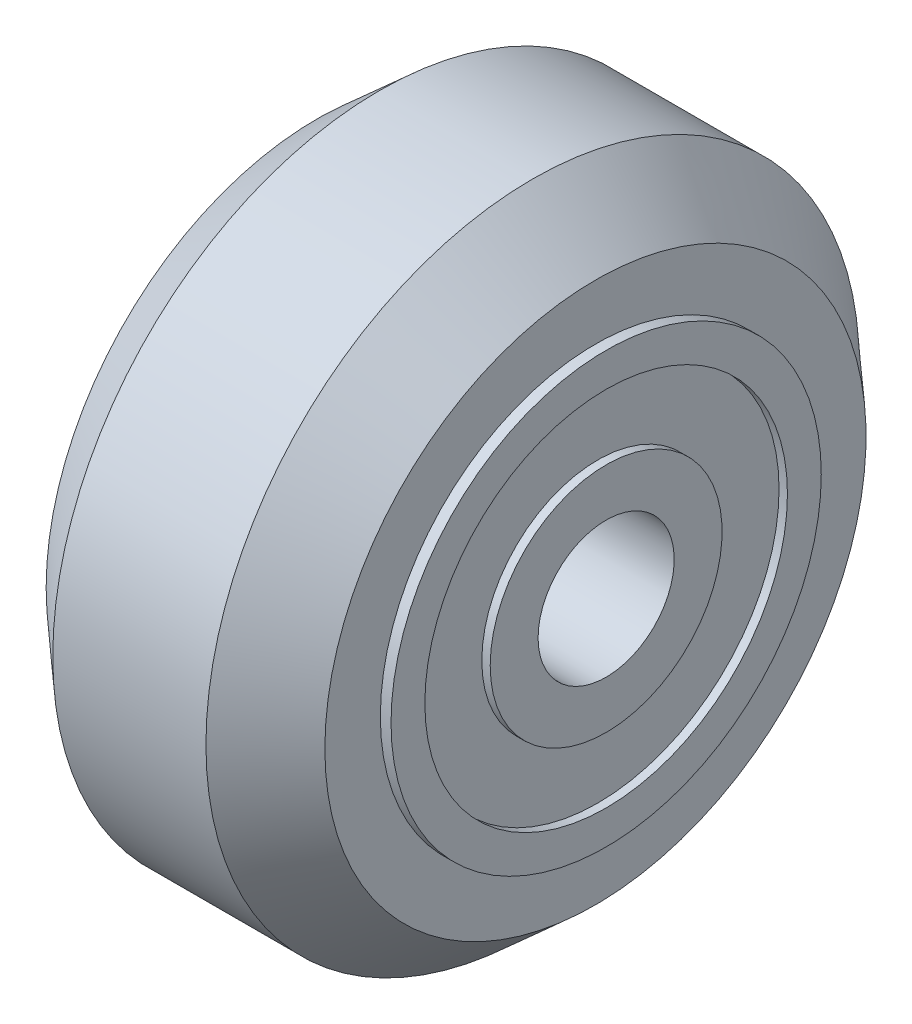
ISO-10303-21;
HEADER;
FILE_DESCRIPTION(('STEP AP214'),'2;1');
FILE_NAME('part.step','',(''),(''),'','','');
FILE_SCHEMA(('AUTOMOTIVE_DESIGN { 1 0 10303 214 1 1 1 1 }'));
ENDSEC;
DATA;
#1=APPLICATION_CONTEXT('core data for automotive mechanical design processes');
#2=APPLICATION_PROTOCOL_DEFINITION('international standard','automotive_design',2000,#1);
#3=PRODUCT_CONTEXT('',#1,'mechanical');
#4=PRODUCT('Part','Part','',(#3));
#5=PRODUCT_RELATED_PRODUCT_CATEGORY('part','',(#4));
#6=PRODUCT_DEFINITION_FORMATION('','',#4);
#7=PRODUCT_DEFINITION_CONTEXT('part definition',#1,'design');
#8=PRODUCT_DEFINITION('design','',#6,#7);
#9=PRODUCT_DEFINITION_SHAPE('','',#8);
#10=(LENGTH_UNIT() NAMED_UNIT(*) SI_UNIT(.MILLI.,.METRE.));
#11=(NAMED_UNIT(*) PLANE_ANGLE_UNIT() SI_UNIT($,.RADIAN.));
#12=(NAMED_UNIT(*) SI_UNIT($,.STERADIAN.) SOLID_ANGLE_UNIT());
#13=UNCERTAINTY_MEASURE_WITH_UNIT(LENGTH_MEASURE(1.E-05),#10,'distance_accuracy_value','');
#14=(GEOMETRIC_REPRESENTATION_CONTEXT(3) GLOBAL_UNCERTAINTY_ASSIGNED_CONTEXT((#13)) GLOBAL_UNIT_ASSIGNED_CONTEXT((#10,
#11,#12)) REPRESENTATION_CONTEXT('',''));
#15=CARTESIAN_POINT('',(0.,0.,0.));
#16=DIRECTION('',(0.,0.,1.));
#17=DIRECTION('',(1.,0.,0.));
#18=AXIS2_PLACEMENT_3D('',#15,#16,#17);
#19=CARTESIAN_POINT('',(0.,0.,0.));
#20=DIRECTION('',(-1.,0.,0.));
#21=DIRECTION('',(0.,0.,1.));
#22=AXIS2_PLACEMENT_3D('',#19,#20,#21);
#23=CYLINDRICAL_SURFACE('',#22,2.515);
#24=CARTESIAN_POINT('',(-5.545,0.,0.));
#25=DIRECTION('',(-1.,0.,0.));
#26=DIRECTION('',(0.,0.,1.));
#27=AXIS2_PLACEMENT_3D('',#24,#25,#26);
#28=CIRCLE('',#27,2.515);
#29=CARTESIAN_POINT('',(-5.545,0.,2.515));
#30=VERTEX_POINT('',#29);
#31=EDGE_CURVE('E10',#30,#30,#28,.T.);
#32=ORIENTED_EDGE('',*,*,#31,.T.);
#33=EDGE_LOOP('',(#32));
#34=FACE_BOUND('',#33,.T.);
#35=CARTESIAN_POINT('',(5.545,0.,0.));
#36=DIRECTION('',(-1.,0.,0.));
#37=DIRECTION('',(0.,0.,1.));
#38=AXIS2_PLACEMENT_3D('',#35,#36,#37);
#39=CIRCLE('',#38,2.515);
#40=CARTESIAN_POINT('',(5.545,0.,2.515));
#41=VERTEX_POINT('',#40);
#42=EDGE_CURVE('E122',#41,#41,#39,.T.);
#43=ORIENTED_EDGE('',*,*,#42,.F.);
#44=EDGE_LOOP('',(#43));
#45=FACE_BOUND('',#44,.T.);
#46=ADVANCED_FACE('F15',(#34,#45),#23,.F.);
#47=CARTESIAN_POINT('',(-5.545,0.,2.515));
#48=DIRECTION('',(-1.,0.,0.));
#49=DIRECTION('',(0.,0.,1.));
#50=AXIS2_PLACEMENT_3D('',#47,#48,#49);
#51=PLANE('',#50);
#52=CARTESIAN_POINT('',(-5.545,0.,0.));
#53=DIRECTION('',(-1.,0.,0.));
#54=DIRECTION('',(0.,0.,1.));
#55=AXIS2_PLACEMENT_3D('',#52,#53,#54);
#56=CIRCLE('',#55,4.285);
#57=CARTESIAN_POINT('',(-5.545,0.,4.285));
#58=VERTEX_POINT('',#57);
#59=EDGE_CURVE('E26',#58,#58,#56,.T.);
#60=ORIENTED_EDGE('',*,*,#59,.T.);
#61=EDGE_LOOP('',(#60));
#62=FACE_BOUND('',#61,.T.);
#63=ORIENTED_EDGE('',*,*,#31,.F.);
#64=EDGE_LOOP('',(#63));
#65=FACE_BOUND('',#64,.T.);
#66=ADVANCED_FACE('F17',(#62,#65),#51,.T.);
#67=CARTESIAN_POINT('',(0.,0.,0.));
#68=DIRECTION('',(-1.,0.,0.));
#69=DIRECTION('',(0.,0.,1.));
#70=AXIS2_PLACEMENT_3D('',#67,#68,#69);
#71=CYLINDRICAL_SURFACE('',#70,4.285);
#72=CARTESIAN_POINT('',(-5.235,0.,0.));
#73=DIRECTION('',(-1.,0.,0.));
#74=DIRECTION('',(0.,0.,1.));
#75=AXIS2_PLACEMENT_3D('',#72,#73,#74);
#76=CIRCLE('',#75,4.285);
#77=CARTESIAN_POINT('',(-5.235,0.,4.285));
#78=VERTEX_POINT('',#77);
#79=EDGE_CURVE('E98',#78,#78,#76,.T.);
#80=ORIENTED_EDGE('',*,*,#79,.T.);
#81=EDGE_LOOP('',(#80));
#82=FACE_BOUND('',#81,.T.);
#83=ORIENTED_EDGE('',*,*,#59,.F.);
#84=EDGE_LOOP('',(#83));
#85=FACE_BOUND('',#84,.T.);
#86=ADVANCED_FACE('F179',(#82,#85),#71,.T.);
#87=CARTESIAN_POINT('',(-5.235,0.,4.285));
#88=DIRECTION('',(-1.,0.,0.));
#89=DIRECTION('',(0.,0.,1.));
#90=AXIS2_PLACEMENT_3D('',#87,#88,#89);
#91=PLANE('',#90);
#92=CARTESIAN_POINT('',(-5.235,0.,0.));
#93=DIRECTION('',(-1.,0.,0.));
#94=DIRECTION('',(0.,0.,1.));
#95=AXIS2_PLACEMENT_3D('',#92,#93,#94);
#96=CIRCLE('',#95,6.7);
#97=CARTESIAN_POINT('',(-5.235,0.,6.7));
#98=VERTEX_POINT('',#97);
#99=EDGE_CURVE('E102',#98,#98,#96,.T.);
#100=ORIENTED_EDGE('',*,*,#99,.T.);
#101=EDGE_LOOP('',(#100));
#102=FACE_BOUND('',#101,.T.);
#103=ORIENTED_EDGE('',*,*,#79,.F.);
#104=EDGE_LOOP('',(#103));
#105=FACE_BOUND('',#104,.T.);
#106=ADVANCED_FACE('F99',(#102,#105),#91,.T.);
#107=CARTESIAN_POINT('',(0.,0.,0.));
#108=DIRECTION('',(-1.,0.,0.));
#109=DIRECTION('',(0.,0.,1.));
#110=AXIS2_PLACEMENT_3D('',#107,#108,#109);
#111=CYLINDRICAL_SURFACE('',#110,6.7);
#112=CARTESIAN_POINT('',(-5.545,0.,0.));
#113=DIRECTION('',(-1.,0.,0.));
#114=DIRECTION('',(0.,0.,1.));
#115=AXIS2_PLACEMENT_3D('',#112,#113,#114);
#116=CIRCLE('',#115,6.7);
#117=CARTESIAN_POINT('',(-5.545,0.,6.7));
#118=VERTEX_POINT('',#117);
#119=EDGE_CURVE('E111',#118,#118,#116,.T.);
#120=ORIENTED_EDGE('',*,*,#119,.T.);
#121=EDGE_LOOP('',(#120));
#122=FACE_BOUND('',#121,.T.);
#123=ORIENTED_EDGE('',*,*,#99,.F.);
#124=EDGE_LOOP('',(#123));
#125=FACE_BOUND('',#124,.T.);
#126=ADVANCED_FACE('F155',(#122,#125),#111,.F.);
#127=CARTESIAN_POINT('',(-5.545,0.,6.7));
#128=DIRECTION('',(-1.,0.,0.));
#129=DIRECTION('',(0.,0.,1.));
#130=AXIS2_PLACEMENT_3D('',#127,#128,#129);
#131=PLANE('',#130);
#132=CARTESIAN_POINT('',(-5.545,0.,0.));
#133=DIRECTION('',(-1.,0.,0.));
#134=DIRECTION('',(0.,0.,1.));
#135=AXIS2_PLACEMENT_3D('',#132,#133,#134);
#136=CIRCLE('',#135,7.95);
#137=CARTESIAN_POINT('',(-5.545,0.,7.95));
#138=VERTEX_POINT('',#137);
#139=EDGE_CURVE('E130',#138,#138,#136,.T.);
#140=ORIENTED_EDGE('',*,*,#139,.T.);
#141=EDGE_LOOP('',(#140));
#142=FACE_BOUND('',#141,.T.);
#143=ORIENTED_EDGE('',*,*,#119,.F.);
#144=EDGE_LOOP('',(#143));
#145=FACE_BOUND('',#144,.T.);
#146=ADVANCED_FACE('F158',(#142,#145),#131,.T.);
#147=CARTESIAN_POINT('',(0.,0.,0.));
#148=DIRECTION('',(-1.,0.,0.));
#149=DIRECTION('',(0.,0.,1.));
#150=AXIS2_PLACEMENT_3D('',#147,#148,#149);
#151=CYLINDRICAL_SURFACE('',#150,7.95);
#152=CARTESIAN_POINT('',(-5.15,0.,0.));
#153=DIRECTION('',(-1.,0.,0.));
#154=DIRECTION('',(0.,0.,1.));
#155=AXIS2_PLACEMENT_3D('',#152,#153,#154);
#156=CIRCLE('',#155,7.95);
#157=CARTESIAN_POINT('',(-5.15,0.,7.95));
#158=VERTEX_POINT('',#157);
#159=EDGE_CURVE('E134',#158,#158,#156,.T.);
#160=ORIENTED_EDGE('',*,*,#159,.T.);
#161=EDGE_LOOP('',(#160));
#162=FACE_BOUND('',#161,.T.);
#163=ORIENTED_EDGE('',*,*,#139,.F.);
#164=EDGE_LOOP('',(#163));
#165=FACE_BOUND('',#164,.T.);
#166=ADVANCED_FACE('F160',(#162,#165),#151,.T.);
#167=CARTESIAN_POINT('',(-5.15,0.,7.95));
#168=DIRECTION('',(-1.,0.,0.));
#169=DIRECTION('',(0.,0.,1.));
#170=AXIS2_PLACEMENT_3D('',#167,#168,#169);
#171=PLANE('',#170);
#172=CARTESIAN_POINT('',(-5.15,0.,0.));
#173=DIRECTION('',(-1.,0.,0.));
#174=DIRECTION('',(0.,0.,1.));
#175=AXIS2_PLACEMENT_3D('',#172,#173,#174);
#176=CIRCLE('',#175,10.);
#177=CARTESIAN_POINT('',(-5.15,0.,10.));
#178=VERTEX_POINT('',#177);
#179=EDGE_CURVE('E146',#178,#178,#176,.T.);
#180=ORIENTED_EDGE('',*,*,#179,.T.);
#181=EDGE_LOOP('',(#180));
#182=FACE_BOUND('',#181,.T.);
#183=ORIENTED_EDGE('',*,*,#159,.F.);
#184=EDGE_LOOP('',(#183));
#185=FACE_BOUND('',#184,.T.);
#186=ADVANCED_FACE('F168',(#182,#185),#171,.T.);
#187=CARTESIAN_POINT('',(-5.15,0.,0.));
#188=DIRECTION('',(1.,0.,0.));
#189=DIRECTION('',(0.,0.,-1.));
#190=AXIS2_PLACEMENT_3D('',#187,#188,#189);
#191=CONICAL_SURFACE('',#190,10.,0.729710634147933);
#192=CARTESIAN_POINT('',(-2.83,0.,0.));
#193=DIRECTION('',(-1.,0.,0.));
#194=DIRECTION('',(0.,0.,1.));
#195=AXIS2_PLACEMENT_3D('',#192,#193,#194);
#196=CIRCLE('',#195,12.075);
#197=CARTESIAN_POINT('',(-2.83,0.,12.075));
#198=VERTEX_POINT('',#197);
#199=EDGE_CURVE('E19',#198,#198,#196,.T.);
#200=ORIENTED_EDGE('',*,*,#199,.T.);
#201=EDGE_LOOP('',(#200));
#202=FACE_BOUND('',#201,.T.);
#203=ORIENTED_EDGE('',*,*,#179,.F.);
#204=EDGE_LOOP('',(#203));
#205=FACE_BOUND('',#204,.T.);
#206=ADVANCED_FACE('F261',(#202,#205),#191,.T.);
#207=CARTESIAN_POINT('',(0.,0.,0.));
#208=DIRECTION('',(-1.,0.,0.));
#209=DIRECTION('',(0.,0.,1.));
#210=AXIS2_PLACEMENT_3D('',#207,#208,#209);
#211=CYLINDRICAL_SURFACE('',#210,12.075);
#212=ORIENTED_EDGE('',*,*,#199,.F.);
#213=EDGE_LOOP('',(#212));
#214=FACE_BOUND('',#213,.T.);
#215=CARTESIAN_POINT('',(2.83,0.,0.));
#216=DIRECTION('',(-1.,0.,0.));
#217=DIRECTION('',(0.,0.,1.));
#218=AXIS2_PLACEMENT_3D('',#215,#216,#217);
#219=CIRCLE('',#218,12.075);
#220=CARTESIAN_POINT('',(2.83,0.,12.075));
#221=VERTEX_POINT('',#220);
#222=EDGE_CURVE('E119',#221,#221,#219,.T.);
#223=ORIENTED_EDGE('',*,*,#222,.T.);
#224=EDGE_LOOP('',(#223));
#225=FACE_BOUND('',#224,.T.);
#226=ADVANCED_FACE('F189',(#214,#225),#211,.T.);
#227=CARTESIAN_POINT('',(5.545,0.,2.515));
#228=DIRECTION('',(1.,0.,0.));
#229=DIRECTION('',(0.,1.,0.));
#230=AXIS2_PLACEMENT_3D('',#227,#228,#229);
#231=PLANE('',#230);
#232=CARTESIAN_POINT('',(5.545,0.,0.));
#233=DIRECTION('',(-1.,0.,0.));
#234=DIRECTION('',(0.,0.,1.));
#235=AXIS2_PLACEMENT_3D('',#232,#233,#234);
#236=CIRCLE('',#235,4.285);
#237=CARTESIAN_POINT('',(5.545,0.,4.285));
#238=VERTEX_POINT('',#237);
#239=EDGE_CURVE('E142',#238,#238,#236,.T.);
#240=ORIENTED_EDGE('',*,*,#239,.F.);
#241=EDGE_LOOP('',(#240));
#242=FACE_BOUND('',#241,.T.);
#243=ORIENTED_EDGE('',*,*,#42,.T.);
#244=EDGE_LOOP('',(#243));
#245=FACE_BOUND('',#244,.T.);
#246=ADVANCED_FACE('F185',(#242,#245),#231,.T.);
#247=CARTESIAN_POINT('',(0.,0.,0.));
#248=DIRECTION('',(1.,0.,0.));
#249=DIRECTION('',(0.,0.,1.));
#250=AXIS2_PLACEMENT_3D('',#247,#248,#249);
#251=CYLINDRICAL_SURFACE('',#250,4.285);
#252=CARTESIAN_POINT('',(5.235,0.,0.));
#253=DIRECTION('',(-1.,0.,0.));
#254=DIRECTION('',(0.,0.,1.));
#255=AXIS2_PLACEMENT_3D('',#252,#253,#254);
#256=CIRCLE('',#255,4.285);
#257=CARTESIAN_POINT('',(5.235,0.,4.285));
#258=VERTEX_POINT('',#257);
#259=EDGE_CURVE('E137',#258,#258,#256,.T.);
#260=ORIENTED_EDGE('',*,*,#259,.F.);
#261=EDGE_LOOP('',(#260));
#262=FACE_BOUND('',#261,.T.);
#263=ORIENTED_EDGE('',*,*,#239,.T.);
#264=EDGE_LOOP('',(#263));
#265=FACE_BOUND('',#264,.T.);
#266=ADVANCED_FACE('F188',(#262,#265),#251,.T.);
#267=CARTESIAN_POINT('',(5.235,0.,4.285));
#268=DIRECTION('',(1.,0.,0.));
#269=DIRECTION('',(0.,1.,0.));
#270=AXIS2_PLACEMENT_3D('',#267,#268,#269);
#271=PLANE('',#270);
#272=CARTESIAN_POINT('',(5.235,0.,0.));
#273=DIRECTION('',(-1.,0.,0.));
#274=DIRECTION('',(0.,0.,1.));
#275=AXIS2_PLACEMENT_3D('',#272,#273,#274);
#276=CIRCLE('',#275,6.7);
#277=CARTESIAN_POINT('',(5.235,0.,6.7));
#278=VERTEX_POINT('',#277);
#279=EDGE_CURVE('E128',#278,#278,#276,.T.);
#280=ORIENTED_EDGE('',*,*,#279,.F.);
#281=EDGE_LOOP('',(#280));
#282=FACE_BOUND('',#281,.T.);
#283=ORIENTED_EDGE('',*,*,#259,.T.);
#284=EDGE_LOOP('',(#283));
#285=FACE_BOUND('',#284,.T.);
#286=ADVANCED_FACE('F220',(#282,#285),#271,.T.);
#287=CARTESIAN_POINT('',(0.,0.,0.));
#288=DIRECTION('',(1.,0.,0.));
#289=DIRECTION('',(0.,0.,1.));
#290=AXIS2_PLACEMENT_3D('',#287,#288,#289);
#291=CYLINDRICAL_SURFACE('',#290,6.7);
#292=CARTESIAN_POINT('',(5.545,0.,0.));
#293=DIRECTION('',(-1.,0.,0.));
#294=DIRECTION('',(0.,0.,1.));
#295=AXIS2_PLACEMENT_3D('',#292,#293,#294);
#296=CIRCLE('',#295,6.7);
#297=CARTESIAN_POINT('',(5.545,0.,6.7));
#298=VERTEX_POINT('',#297);
#299=EDGE_CURVE('E124',#298,#298,#296,.T.);
#300=ORIENTED_EDGE('',*,*,#299,.F.);
#301=EDGE_LOOP('',(#300));
#302=FACE_BOUND('',#301,.T.);
#303=ORIENTED_EDGE('',*,*,#279,.T.);
#304=EDGE_LOOP('',(#303));
#305=FACE_BOUND('',#304,.T.);
#306=ADVANCED_FACE('F248',(#302,#305),#291,.F.);
#307=CARTESIAN_POINT('',(5.545,0.,6.7));
#308=DIRECTION('',(1.,0.,0.));
#309=DIRECTION('',(0.,1.,0.));
#310=AXIS2_PLACEMENT_3D('',#307,#308,#309);
#311=PLANE('',#310);
#312=CARTESIAN_POINT('',(5.545,0.,0.));
#313=DIRECTION('',(-1.,0.,0.));
#314=DIRECTION('',(0.,0.,1.));
#315=AXIS2_PLACEMENT_3D('',#312,#313,#314);
#316=CIRCLE('',#315,7.95);
#317=CARTESIAN_POINT('',(5.545,0.,7.95));
#318=VERTEX_POINT('',#317);
#319=EDGE_CURVE('E129',#318,#318,#316,.T.);
#320=ORIENTED_EDGE('',*,*,#319,.F.);
#321=EDGE_LOOP('',(#320));
#322=FACE_BOUND('',#321,.T.);
#323=ORIENTED_EDGE('',*,*,#299,.T.);
#324=EDGE_LOOP('',(#323));
#325=FACE_BOUND('',#324,.T.);
#326=ADVANCED_FACE('F201',(#322,#325),#311,.T.);
#327=CARTESIAN_POINT('',(0.,0.,0.));
#328=DIRECTION('',(1.,0.,0.));
#329=DIRECTION('',(0.,0.,1.));
#330=AXIS2_PLACEMENT_3D('',#327,#328,#329);
#331=CYLINDRICAL_SURFACE('',#330,7.95);
#332=CARTESIAN_POINT('',(5.15,0.,0.));
#333=DIRECTION('',(-1.,0.,0.));
#334=DIRECTION('',(0.,0.,1.));
#335=AXIS2_PLACEMENT_3D('',#332,#333,#334);
#336=CIRCLE('',#335,7.95);
#337=CARTESIAN_POINT('',(5.15,0.,7.95));
#338=VERTEX_POINT('',#337);
#339=EDGE_CURVE('E118',#338,#338,#336,.T.);
#340=ORIENTED_EDGE('',*,*,#339,.F.);
#341=EDGE_LOOP('',(#340));
#342=FACE_BOUND('',#341,.T.);
#343=ORIENTED_EDGE('',*,*,#319,.T.);
#344=EDGE_LOOP('',(#343));
#345=FACE_BOUND('',#344,.T.);
#346=ADVANCED_FACE('F194',(#342,#345),#331,.T.);
#347=CARTESIAN_POINT('',(5.15,0.,7.95));
#348=DIRECTION('',(1.,0.,0.));
#349=DIRECTION('',(0.,1.,0.));
#350=AXIS2_PLACEMENT_3D('',#347,#348,#349);
#351=PLANE('',#350);
#352=CARTESIAN_POINT('',(5.15,0.,0.));
#353=DIRECTION('',(-1.,0.,0.));
#354=DIRECTION('',(0.,0.,1.));
#355=AXIS2_PLACEMENT_3D('',#352,#353,#354);
#356=CIRCLE('',#355,10.);
#357=CARTESIAN_POINT('',(5.15,0.,10.));
#358=VERTEX_POINT('',#357);
#359=EDGE_CURVE('E115',#358,#358,#356,.T.);
#360=ORIENTED_EDGE('',*,*,#359,.F.);
#361=EDGE_LOOP('',(#360));
#362=FACE_BOUND('',#361,.T.);
#363=ORIENTED_EDGE('',*,*,#339,.T.);
#364=EDGE_LOOP('',(#363));
#365=FACE_BOUND('',#364,.T.);
#366=ADVANCED_FACE('F191',(#362,#365),#351,.T.);
#367=CARTESIAN_POINT('',(5.15,0.,0.));
#368=DIRECTION('',(-1.,0.,0.));
#369=DIRECTION('',(0.,0.,-1.));
#370=AXIS2_PLACEMENT_3D('',#367,#368,#369);
#371=CONICAL_SURFACE('',#370,10.,0.729710634147933);
#372=ORIENTED_EDGE('',*,*,#222,.F.);
#373=EDGE_LOOP('',(#372));
#374=FACE_BOUND('',#373,.T.);
#375=ORIENTED_EDGE('',*,*,#359,.T.);
#376=EDGE_LOOP('',(#375));
#377=FACE_BOUND('',#376,.T.);
#378=ADVANCED_FACE('F193',(#374,#377),#371,.T.);
#379=CLOSED_SHELL('',(#46,#66,#86,#106,#126,#146,#166,#186,#206,#226,#246,#266,#286,#306,#326,
#346,#366,#378));
#380=MANIFOLD_SOLID_BREP('B1',#379);
#381=ADVANCED_BREP_SHAPE_REPRESENTATION('',(#18,#380),#14);
#382=SHAPE_DEFINITION_REPRESENTATION(#9,#381);
ENDSEC;
END-ISO-10303-21;
